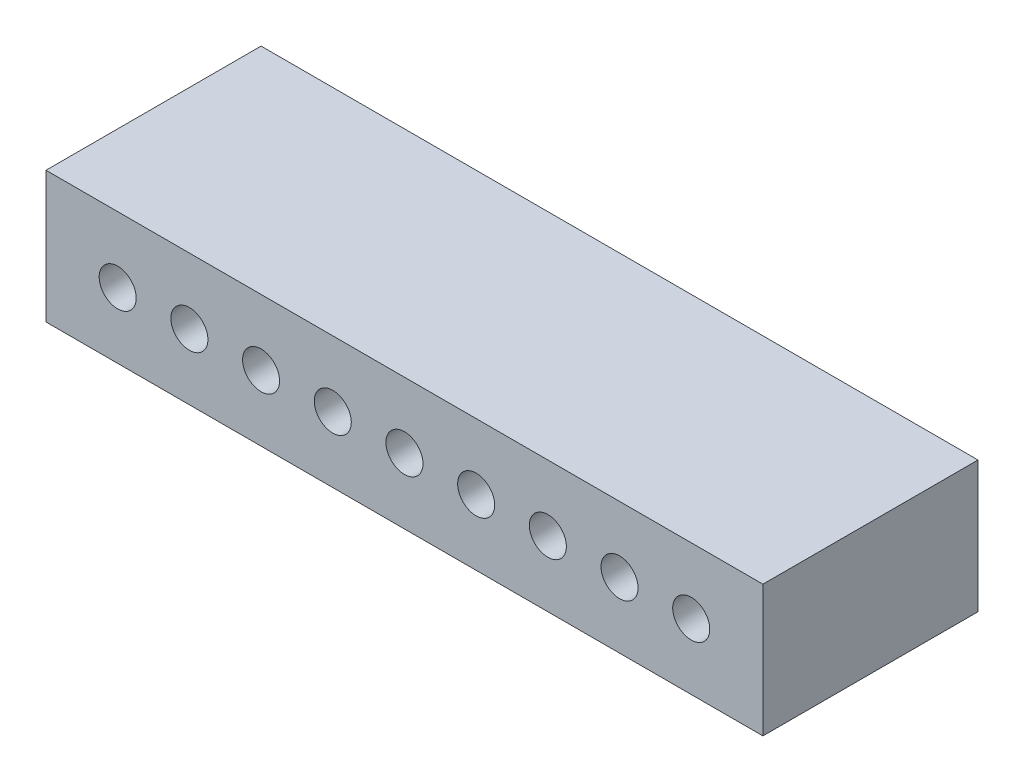
ISO-10303-21;
HEADER;
FILE_DESCRIPTION(('STEP AP214'),'2;1');
FILE_NAME('part.step','',(''),(''),'','','');
FILE_SCHEMA(('AUTOMOTIVE_DESIGN { 1 0 10303 214 1 1 1 1 }'));
ENDSEC;
DATA;
#1=APPLICATION_CONTEXT('core data for automotive mechanical design processes');
#2=APPLICATION_PROTOCOL_DEFINITION('international standard','automotive_design',2000,#1);
#3=PRODUCT_CONTEXT('',#1,'mechanical');
#4=PRODUCT('Part','Part','',(#3));
#5=PRODUCT_RELATED_PRODUCT_CATEGORY('part','',(#4));
#6=PRODUCT_DEFINITION_FORMATION('','',#4);
#7=PRODUCT_DEFINITION_CONTEXT('part definition',#1,'design');
#8=PRODUCT_DEFINITION('design','',#6,#7);
#9=PRODUCT_DEFINITION_SHAPE('','',#8);
#10=(LENGTH_UNIT() NAMED_UNIT(*) SI_UNIT(.MILLI.,.METRE.));
#11=(NAMED_UNIT(*) PLANE_ANGLE_UNIT() SI_UNIT($,.RADIAN.));
#12=(NAMED_UNIT(*) SI_UNIT($,.STERADIAN.) SOLID_ANGLE_UNIT());
#13=UNCERTAINTY_MEASURE_WITH_UNIT(LENGTH_MEASURE(1.E-05),#10,'distance_accuracy_value','');
#14=(GEOMETRIC_REPRESENTATION_CONTEXT(3) GLOBAL_UNCERTAINTY_ASSIGNED_CONTEXT((#13)) GLOBAL_UNIT_ASSIGNED_CONTEXT((#10,
#11,#12)) REPRESENTATION_CONTEXT('',''));
#15=CARTESIAN_POINT('',(0.,0.,0.));
#16=DIRECTION('',(0.,0.,1.));
#17=DIRECTION('',(1.,0.,0.));
#18=AXIS2_PLACEMENT_3D('',#15,#16,#17);
#19=CARTESIAN_POINT('',(30.,11.,-9.));
#20=DIRECTION('',(-1.,0.,0.));
#21=DIRECTION('',(0.,0.,1.));
#22=AXIS2_PLACEMENT_3D('',#19,#20,#21);
#23=PLANE('',#22);
#24=DIRECTION('',(0.,0.,-1.));
#25=VECTOR('',#24,1.);
#26=CARTESIAN_POINT('',(30.,0.,-9.));
#27=LINE('',#26,#25);
#28=CARTESIAN_POINT('',(30.,0.,9.));
#29=VERTEX_POINT('',#28);
#30=CARTESIAN_POINT('',(30.,0.,-9.));
#31=VERTEX_POINT('',#30);
#32=EDGE_CURVE('E107',#29,#31,#27,.T.);
#33=ORIENTED_EDGE('',*,*,#32,.T.);
#34=DIRECTION('',(0.,-1.,0.));
#35=VECTOR('',#34,1.);
#36=CARTESIAN_POINT('',(30.,11.,-9.));
#37=LINE('',#36,#35);
#38=CARTESIAN_POINT('',(30.,11.,-9.));
#39=VERTEX_POINT('',#38);
#40=EDGE_CURVE('E11',#39,#31,#37,.T.);
#41=ORIENTED_EDGE('',*,*,#40,.F.);
#42=DIRECTION('',(0.,0.,-1.));
#43=VECTOR('',#42,1.);
#44=CARTESIAN_POINT('',(30.,11.,-9.));
#45=LINE('',#44,#43);
#46=CARTESIAN_POINT('',(30.,11.,9.));
#47=VERTEX_POINT('',#46);
#48=EDGE_CURVE('E91',#47,#39,#45,.T.);
#49=ORIENTED_EDGE('',*,*,#48,.F.);
#50=DIRECTION('',(0.,-1.,0.));
#51=VECTOR('',#50,1.);
#52=CARTESIAN_POINT('',(30.,11.,9.));
#53=LINE('',#52,#51);
#54=EDGE_CURVE('E103',#47,#29,#53,.T.);
#55=ORIENTED_EDGE('',*,*,#54,.T.);
#56=EDGE_LOOP('',(#33,#41,#49,#55));
#57=FACE_BOUND('',#56,.T.);
#58=ADVANCED_FACE('F39',(#57),#23,.F.);
#59=CARTESIAN_POINT('',(-30.,11.,-9.));
#60=DIRECTION('',(0.,0.,1.));
#61=DIRECTION('',(1.,0.,0.));
#62=AXIS2_PLACEMENT_3D('',#59,#60,#61);
#63=PLANE('',#62);
#64=CARTESIAN_POINT('',(-24.,5.5,-9.));
#65=DIRECTION('',(0.,0.,1.));
#66=DIRECTION('',(1.,0.,0.));
#67=AXIS2_PLACEMENT_3D('',#64,#65,#66);
#68=CIRCLE('',#67,1.54999999999999);
#69=CARTESIAN_POINT('',(-22.45,5.5,-9.));
#70=VERTEX_POINT('',#69);
#71=EDGE_CURVE('E111',#70,#70,#68,.T.);
#72=ORIENTED_EDGE('',*,*,#71,.T.);
#73=EDGE_LOOP('',(#72));
#74=FACE_BOUND('',#73,.T.);
#75=CARTESIAN_POINT('',(-18.,5.5,-9.));
#76=DIRECTION('',(0.,0.,1.));
#77=DIRECTION('',(1.,0.,0.));
#78=AXIS2_PLACEMENT_3D('',#75,#76,#77);
#79=CIRCLE('',#78,1.55);
#80=CARTESIAN_POINT('',(-16.45,5.5,-9.));
#81=VERTEX_POINT('',#80);
#82=EDGE_CURVE('E188',#81,#81,#79,.T.);
#83=ORIENTED_EDGE('',*,*,#82,.T.);
#84=EDGE_LOOP('',(#83));
#85=FACE_BOUND('',#84,.T.);
#86=CARTESIAN_POINT('',(-12.,5.5,-9.));
#87=DIRECTION('',(0.,0.,1.));
#88=DIRECTION('',(1.,0.,0.));
#89=AXIS2_PLACEMENT_3D('',#86,#87,#88);
#90=CIRCLE('',#89,1.55);
#91=CARTESIAN_POINT('',(-10.45,5.5,-9.));
#92=VERTEX_POINT('',#91);
#93=EDGE_CURVE('E180',#92,#92,#90,.T.);
#94=ORIENTED_EDGE('',*,*,#93,.T.);
#95=EDGE_LOOP('',(#94));
#96=FACE_BOUND('',#95,.T.);
#97=CARTESIAN_POINT('',(-6.,5.5,-9.));
#98=DIRECTION('',(0.,0.,1.));
#99=DIRECTION('',(1.,0.,0.));
#100=AXIS2_PLACEMENT_3D('',#97,#98,#99);
#101=CIRCLE('',#100,1.55);
#102=CARTESIAN_POINT('',(-4.45,5.5,-9.));
#103=VERTEX_POINT('',#102);
#104=EDGE_CURVE('E172',#103,#103,#101,.T.);
#105=ORIENTED_EDGE('',*,*,#104,.T.);
#106=EDGE_LOOP('',(#105));
#107=FACE_BOUND('',#106,.T.);
#108=CARTESIAN_POINT('',(0.,5.5,-9.));
#109=DIRECTION('',(0.,0.,1.));
#110=DIRECTION('',(1.,0.,0.));
#111=AXIS2_PLACEMENT_3D('',#108,#109,#110);
#112=CIRCLE('',#111,1.55);
#113=CARTESIAN_POINT('',(1.54999999999999,5.5,-9.));
#114=VERTEX_POINT('',#113);
#115=EDGE_CURVE('E164',#114,#114,#112,.T.);
#116=ORIENTED_EDGE('',*,*,#115,.T.);
#117=EDGE_LOOP('',(#116));
#118=FACE_BOUND('',#117,.T.);
#119=CARTESIAN_POINT('',(6.,5.5,-9.));
#120=DIRECTION('',(0.,0.,1.));
#121=DIRECTION('',(1.,0.,0.));
#122=AXIS2_PLACEMENT_3D('',#119,#120,#121);
#123=CIRCLE('',#122,1.55);
#124=CARTESIAN_POINT('',(7.55,5.5,-9.));
#125=VERTEX_POINT('',#124);
#126=EDGE_CURVE('E156',#125,#125,#123,.T.);
#127=ORIENTED_EDGE('',*,*,#126,.T.);
#128=EDGE_LOOP('',(#127));
#129=FACE_BOUND('',#128,.T.);
#130=CARTESIAN_POINT('',(12.,5.5,-9.));
#131=DIRECTION('',(0.,0.,1.));
#132=DIRECTION('',(1.,0.,0.));
#133=AXIS2_PLACEMENT_3D('',#130,#131,#132);
#134=CIRCLE('',#133,1.55);
#135=CARTESIAN_POINT('',(13.55,5.5,-9.));
#136=VERTEX_POINT('',#135);
#137=EDGE_CURVE('E148',#136,#136,#134,.T.);
#138=ORIENTED_EDGE('',*,*,#137,.T.);
#139=EDGE_LOOP('',(#138));
#140=FACE_BOUND('',#139,.T.);
#141=CARTESIAN_POINT('',(18.,5.5,-9.));
#142=DIRECTION('',(0.,0.,1.));
#143=DIRECTION('',(1.,0.,0.));
#144=AXIS2_PLACEMENT_3D('',#141,#142,#143);
#145=CIRCLE('',#144,1.55);
#146=CARTESIAN_POINT('',(19.55,5.5,-9.));
#147=VERTEX_POINT('',#146);
#148=EDGE_CURVE('E140',#147,#147,#145,.T.);
#149=ORIENTED_EDGE('',*,*,#148,.T.);
#150=EDGE_LOOP('',(#149));
#151=FACE_BOUND('',#150,.T.);
#152=CARTESIAN_POINT('',(24.,5.5,-9.));
#153=DIRECTION('',(0.,0.,1.));
#154=DIRECTION('',(1.,0.,0.));
#155=AXIS2_PLACEMENT_3D('',#152,#153,#154);
#156=CIRCLE('',#155,1.55);
#157=CARTESIAN_POINT('',(25.55,5.5,-9.));
#158=VERTEX_POINT('',#157);
#159=EDGE_CURVE('E132',#158,#158,#156,.T.);
#160=ORIENTED_EDGE('',*,*,#159,.T.);
#161=EDGE_LOOP('',(#160));
#162=FACE_BOUND('',#161,.T.);
#163=DIRECTION('',(-1.,0.,0.));
#164=VECTOR('',#163,1.);
#165=CARTESIAN_POINT('',(-30.,0.,-9.));
#166=LINE('',#165,#164);
#167=CARTESIAN_POINT('',(-30.,0.,-9.));
#168=VERTEX_POINT('',#167);
#169=EDGE_CURVE('E96',#31,#168,#166,.T.);
#170=ORIENTED_EDGE('',*,*,#169,.T.);
#171=DIRECTION('',(0.,-1.,0.));
#172=VECTOR('',#171,1.);
#173=CARTESIAN_POINT('',(-30.,11.,-9.));
#174=LINE('',#173,#172);
#175=CARTESIAN_POINT('',(-30.,11.,-9.));
#176=VERTEX_POINT('',#175);
#177=EDGE_CURVE('E48',#176,#168,#174,.T.);
#178=ORIENTED_EDGE('',*,*,#177,.F.);
#179=DIRECTION('',(-1.,0.,0.));
#180=VECTOR('',#179,1.);
#181=CARTESIAN_POINT('',(-30.,11.,-9.));
#182=LINE('',#181,#180);
#183=EDGE_CURVE('E86',#39,#176,#182,.T.);
#184=ORIENTED_EDGE('',*,*,#183,.F.);
#185=ORIENTED_EDGE('',*,*,#40,.T.);
#186=EDGE_LOOP('',(#170,#178,#184,#185));
#187=FACE_BOUND('',#186,.T.);
#188=ADVANCED_FACE('F95',(#74,#85,#96,#107,#118,#129,#140,#151,#162,#187),#63,.F.);
#189=CARTESIAN_POINT('',(-30.,11.,-9.));
#190=DIRECTION('',(1.,0.,0.));
#191=DIRECTION('',(0.,0.,-1.));
#192=AXIS2_PLACEMENT_3D('',#189,#190,#191);
#193=PLANE('',#192);
#194=DIRECTION('',(0.,0.,1.));
#195=VECTOR('',#194,1.);
#196=CARTESIAN_POINT('',(-30.,0.,-9.));
#197=LINE('',#196,#195);
#198=CARTESIAN_POINT('',(-30.,0.,9.));
#199=VERTEX_POINT('',#198);
#200=EDGE_CURVE('E73',#168,#199,#197,.T.);
#201=ORIENTED_EDGE('',*,*,#200,.T.);
#202=DIRECTION('',(0.,-1.,0.));
#203=VECTOR('',#202,1.);
#204=CARTESIAN_POINT('',(-30.,11.,9.));
#205=LINE('',#204,#203);
#206=CARTESIAN_POINT('',(-30.,11.,9.));
#207=VERTEX_POINT('',#206);
#208=EDGE_CURVE('E98',#207,#199,#205,.T.);
#209=ORIENTED_EDGE('',*,*,#208,.F.);
#210=DIRECTION('',(0.,0.,1.));
#211=VECTOR('',#210,1.);
#212=CARTESIAN_POINT('',(-30.,11.,-9.));
#213=LINE('',#212,#211);
#214=EDGE_CURVE('E89',#176,#207,#213,.T.);
#215=ORIENTED_EDGE('',*,*,#214,.F.);
#216=ORIENTED_EDGE('',*,*,#177,.T.);
#217=EDGE_LOOP('',(#201,#209,#215,#216));
#218=FACE_BOUND('',#217,.T.);
#219=ADVANCED_FACE('F99',(#218),#193,.F.);
#220=CARTESIAN_POINT('',(-30.,11.,9.));
#221=DIRECTION('',(0.,0.,-1.));
#222=DIRECTION('',(-1.,0.,0.));
#223=AXIS2_PLACEMENT_3D('',#220,#221,#222);
#224=PLANE('',#223);
#225=CARTESIAN_POINT('',(-24.,5.5,9.));
#226=DIRECTION('',(0.,0.,1.));
#227=DIRECTION('',(1.,0.,0.));
#228=AXIS2_PLACEMENT_3D('',#225,#226,#227);
#229=CIRCLE('',#228,1.54999999999999);
#230=CARTESIAN_POINT('',(-22.45,5.5,9.));
#231=VERTEX_POINT('',#230);
#232=EDGE_CURVE('E192',#231,#231,#229,.T.);
#233=ORIENTED_EDGE('',*,*,#232,.F.);
#234=EDGE_LOOP('',(#233));
#235=FACE_BOUND('',#234,.T.);
#236=CARTESIAN_POINT('',(-18.,5.5,9.));
#237=DIRECTION('',(0.,0.,1.));
#238=DIRECTION('',(1.,0.,0.));
#239=AXIS2_PLACEMENT_3D('',#236,#237,#238);
#240=CIRCLE('',#239,1.55);
#241=CARTESIAN_POINT('',(-16.45,5.5,9.));
#242=VERTEX_POINT('',#241);
#243=EDGE_CURVE('E184',#242,#242,#240,.T.);
#244=ORIENTED_EDGE('',*,*,#243,.F.);
#245=EDGE_LOOP('',(#244));
#246=FACE_BOUND('',#245,.T.);
#247=CARTESIAN_POINT('',(-12.,5.5,9.));
#248=DIRECTION('',(0.,0.,1.));
#249=DIRECTION('',(1.,0.,0.));
#250=AXIS2_PLACEMENT_3D('',#247,#248,#249);
#251=CIRCLE('',#250,1.55);
#252=CARTESIAN_POINT('',(-10.45,5.5,9.));
#253=VERTEX_POINT('',#252);
#254=EDGE_CURVE('E176',#253,#253,#251,.T.);
#255=ORIENTED_EDGE('',*,*,#254,.F.);
#256=EDGE_LOOP('',(#255));
#257=FACE_BOUND('',#256,.T.);
#258=CARTESIAN_POINT('',(-6.,5.5,9.));
#259=DIRECTION('',(0.,0.,1.));
#260=DIRECTION('',(1.,0.,0.));
#261=AXIS2_PLACEMENT_3D('',#258,#259,#260);
#262=CIRCLE('',#261,1.55);
#263=CARTESIAN_POINT('',(-4.45,5.5,9.));
#264=VERTEX_POINT('',#263);
#265=EDGE_CURVE('E168',#264,#264,#262,.T.);
#266=ORIENTED_EDGE('',*,*,#265,.F.);
#267=EDGE_LOOP('',(#266));
#268=FACE_BOUND('',#267,.T.);
#269=CARTESIAN_POINT('',(0.,5.5,9.));
#270=DIRECTION('',(0.,0.,1.));
#271=DIRECTION('',(1.,0.,0.));
#272=AXIS2_PLACEMENT_3D('',#269,#270,#271);
#273=CIRCLE('',#272,1.55);
#274=CARTESIAN_POINT('',(1.54999999999999,5.5,9.));
#275=VERTEX_POINT('',#274);
#276=EDGE_CURVE('E160',#275,#275,#273,.T.);
#277=ORIENTED_EDGE('',*,*,#276,.F.);
#278=EDGE_LOOP('',(#277));
#279=FACE_BOUND('',#278,.T.);
#280=CARTESIAN_POINT('',(6.,5.5,9.));
#281=DIRECTION('',(0.,0.,1.));
#282=DIRECTION('',(1.,0.,0.));
#283=AXIS2_PLACEMENT_3D('',#280,#281,#282);
#284=CIRCLE('',#283,1.55);
#285=CARTESIAN_POINT('',(7.55,5.5,9.));
#286=VERTEX_POINT('',#285);
#287=EDGE_CURVE('E152',#286,#286,#284,.T.);
#288=ORIENTED_EDGE('',*,*,#287,.F.);
#289=EDGE_LOOP('',(#288));
#290=FACE_BOUND('',#289,.T.);
#291=CARTESIAN_POINT('',(12.,5.5,9.));
#292=DIRECTION('',(0.,0.,1.));
#293=DIRECTION('',(1.,0.,0.));
#294=AXIS2_PLACEMENT_3D('',#291,#292,#293);
#295=CIRCLE('',#294,1.55);
#296=CARTESIAN_POINT('',(13.55,5.5,9.));
#297=VERTEX_POINT('',#296);
#298=EDGE_CURVE('E144',#297,#297,#295,.T.);
#299=ORIENTED_EDGE('',*,*,#298,.F.);
#300=EDGE_LOOP('',(#299));
#301=FACE_BOUND('',#300,.T.);
#302=CARTESIAN_POINT('',(18.,5.5,9.));
#303=DIRECTION('',(0.,0.,1.));
#304=DIRECTION('',(1.,0.,0.));
#305=AXIS2_PLACEMENT_3D('',#302,#303,#304);
#306=CIRCLE('',#305,1.55);
#307=CARTESIAN_POINT('',(19.55,5.5,9.));
#308=VERTEX_POINT('',#307);
#309=EDGE_CURVE('E136',#308,#308,#306,.T.);
#310=ORIENTED_EDGE('',*,*,#309,.F.);
#311=EDGE_LOOP('',(#310));
#312=FACE_BOUND('',#311,.T.);
#313=CARTESIAN_POINT('',(24.,5.5,9.));
#314=DIRECTION('',(0.,0.,1.));
#315=DIRECTION('',(1.,0.,0.));
#316=AXIS2_PLACEMENT_3D('',#313,#314,#315);
#317=CIRCLE('',#316,1.55);
#318=CARTESIAN_POINT('',(25.55,5.5,9.));
#319=VERTEX_POINT('',#318);
#320=EDGE_CURVE('E128',#319,#319,#317,.T.);
#321=ORIENTED_EDGE('',*,*,#320,.F.);
#322=EDGE_LOOP('',(#321));
#323=FACE_BOUND('',#322,.T.);
#324=DIRECTION('',(1.,0.,0.));
#325=VECTOR('',#324,1.);
#326=CARTESIAN_POINT('',(-30.,0.,9.));
#327=LINE('',#326,#325);
#328=EDGE_CURVE('E79',#199,#29,#327,.T.);
#329=ORIENTED_EDGE('',*,*,#328,.T.);
#330=ORIENTED_EDGE('',*,*,#54,.F.);
#331=DIRECTION('',(1.,0.,0.));
#332=VECTOR('',#331,1.);
#333=CARTESIAN_POINT('',(-30.,11.,9.));
#334=LINE('',#333,#332);
#335=EDGE_CURVE('E56',#207,#47,#334,.T.);
#336=ORIENTED_EDGE('',*,*,#335,.F.);
#337=ORIENTED_EDGE('',*,*,#208,.T.);
#338=EDGE_LOOP('',(#329,#330,#336,#337));
#339=FACE_BOUND('',#338,.T.);
#340=ADVANCED_FACE('F121',(#235,#246,#257,#268,#279,#290,#301,#312,#323,#339),#224,.F.);
#341=CARTESIAN_POINT('',(0.,11.,0.));
#342=DIRECTION('',(0.,1.,0.));
#343=DIRECTION('',(0.,0.,1.));
#344=AXIS2_PLACEMENT_3D('',#341,#342,#343);
#345=PLANE('',#344);
#346=ORIENTED_EDGE('',*,*,#48,.T.);
#347=ORIENTED_EDGE('',*,*,#183,.T.);
#348=ORIENTED_EDGE('',*,*,#214,.T.);
#349=ORIENTED_EDGE('',*,*,#335,.T.);
#350=EDGE_LOOP('',(#346,#347,#348,#349));
#351=FACE_BOUND('',#350,.T.);
#352=ADVANCED_FACE('F87',(#351),#345,.T.);
#353=CARTESIAN_POINT('',(0.,0.,0.));
#354=DIRECTION('',(0.,1.,0.));
#355=DIRECTION('',(0.,0.,1.));
#356=AXIS2_PLACEMENT_3D('',#353,#354,#355);
#357=PLANE('',#356);
#358=ORIENTED_EDGE('',*,*,#32,.F.);
#359=ORIENTED_EDGE('',*,*,#328,.F.);
#360=ORIENTED_EDGE('',*,*,#200,.F.);
#361=ORIENTED_EDGE('',*,*,#169,.F.);
#362=EDGE_LOOP('',(#358,#359,#360,#361));
#363=FACE_BOUND('',#362,.T.);
#364=ADVANCED_FACE('F124',(#363),#357,.F.);
#365=CARTESIAN_POINT('',(24.,5.5,-9.));
#366=DIRECTION('',(0.,0.,1.));
#367=DIRECTION('',(1.,0.,0.));
#368=AXIS2_PLACEMENT_3D('',#365,#366,#367);
#369=CYLINDRICAL_SURFACE('',#368,1.55);
#370=ORIENTED_EDGE('',*,*,#159,.F.);
#371=EDGE_LOOP('',(#370));
#372=FACE_BOUND('',#371,.T.);
#373=ORIENTED_EDGE('',*,*,#320,.T.);
#374=EDGE_LOOP('',(#373));
#375=FACE_BOUND('',#374,.T.);
#376=ADVANCED_FACE('F228',(#372,#375),#369,.F.);
#377=CARTESIAN_POINT('',(18.,5.5,-9.));
#378=DIRECTION('',(0.,0.,1.));
#379=DIRECTION('',(1.,0.,0.));
#380=AXIS2_PLACEMENT_3D('',#377,#378,#379);
#381=CYLINDRICAL_SURFACE('',#380,1.55);
#382=ORIENTED_EDGE('',*,*,#148,.F.);
#383=EDGE_LOOP('',(#382));
#384=FACE_BOUND('',#383,.T.);
#385=ORIENTED_EDGE('',*,*,#309,.T.);
#386=EDGE_LOOP('',(#385));
#387=FACE_BOUND('',#386,.T.);
#388=ADVANCED_FACE('F230',(#384,#387),#381,.F.);
#389=CARTESIAN_POINT('',(12.,5.5,-9.));
#390=DIRECTION('',(0.,0.,1.));
#391=DIRECTION('',(1.,0.,0.));
#392=AXIS2_PLACEMENT_3D('',#389,#390,#391);
#393=CYLINDRICAL_SURFACE('',#392,1.55);
#394=ORIENTED_EDGE('',*,*,#137,.F.);
#395=EDGE_LOOP('',(#394));
#396=FACE_BOUND('',#395,.T.);
#397=ORIENTED_EDGE('',*,*,#298,.T.);
#398=EDGE_LOOP('',(#397));
#399=FACE_BOUND('',#398,.T.);
#400=ADVANCED_FACE('F237',(#396,#399),#393,.F.);
#401=CARTESIAN_POINT('',(6.,5.5,-9.));
#402=DIRECTION('',(0.,0.,1.));
#403=DIRECTION('',(1.,0.,0.));
#404=AXIS2_PLACEMENT_3D('',#401,#402,#403);
#405=CYLINDRICAL_SURFACE('',#404,1.55);
#406=ORIENTED_EDGE('',*,*,#126,.F.);
#407=EDGE_LOOP('',(#406));
#408=FACE_BOUND('',#407,.T.);
#409=ORIENTED_EDGE('',*,*,#287,.T.);
#410=EDGE_LOOP('',(#409));
#411=FACE_BOUND('',#410,.T.);
#412=ADVANCED_FACE('F290',(#408,#411),#405,.F.);
#413=CARTESIAN_POINT('',(0.,5.5,-9.));
#414=DIRECTION('',(0.,0.,1.));
#415=DIRECTION('',(1.,0.,0.));
#416=AXIS2_PLACEMENT_3D('',#413,#414,#415);
#417=CYLINDRICAL_SURFACE('',#416,1.55);
#418=ORIENTED_EDGE('',*,*,#115,.F.);
#419=EDGE_LOOP('',(#418));
#420=FACE_BOUND('',#419,.T.);
#421=ORIENTED_EDGE('',*,*,#276,.T.);
#422=EDGE_LOOP('',(#421));
#423=FACE_BOUND('',#422,.T.);
#424=ADVANCED_FACE('F300',(#420,#423),#417,.F.);
#425=CARTESIAN_POINT('',(-6.,5.5,-9.));
#426=DIRECTION('',(0.,0.,1.));
#427=DIRECTION('',(1.,0.,0.));
#428=AXIS2_PLACEMENT_3D('',#425,#426,#427);
#429=CYLINDRICAL_SURFACE('',#428,1.55);
#430=ORIENTED_EDGE('',*,*,#104,.F.);
#431=EDGE_LOOP('',(#430));
#432=FACE_BOUND('',#431,.T.);
#433=ORIENTED_EDGE('',*,*,#265,.T.);
#434=EDGE_LOOP('',(#433));
#435=FACE_BOUND('',#434,.T.);
#436=ADVANCED_FACE('F310',(#432,#435),#429,.F.);
#437=CARTESIAN_POINT('',(-12.,5.5,-9.));
#438=DIRECTION('',(0.,0.,1.));
#439=DIRECTION('',(1.,0.,0.));
#440=AXIS2_PLACEMENT_3D('',#437,#438,#439);
#441=CYLINDRICAL_SURFACE('',#440,1.55);
#442=ORIENTED_EDGE('',*,*,#93,.F.);
#443=EDGE_LOOP('',(#442));
#444=FACE_BOUND('',#443,.T.);
#445=ORIENTED_EDGE('',*,*,#254,.T.);
#446=EDGE_LOOP('',(#445));
#447=FACE_BOUND('',#446,.T.);
#448=ADVANCED_FACE('F320',(#444,#447),#441,.F.);
#449=CARTESIAN_POINT('',(-18.,5.5,-9.));
#450=DIRECTION('',(0.,0.,1.));
#451=DIRECTION('',(1.,0.,0.));
#452=AXIS2_PLACEMENT_3D('',#449,#450,#451);
#453=CYLINDRICAL_SURFACE('',#452,1.55);
#454=ORIENTED_EDGE('',*,*,#82,.F.);
#455=EDGE_LOOP('',(#454));
#456=FACE_BOUND('',#455,.T.);
#457=ORIENTED_EDGE('',*,*,#243,.T.);
#458=EDGE_LOOP('',(#457));
#459=FACE_BOUND('',#458,.T.);
#460=ADVANCED_FACE('F205',(#456,#459),#453,.F.);
#461=CARTESIAN_POINT('',(-24.,5.5,-9.));
#462=DIRECTION('',(0.,0.,1.));
#463=DIRECTION('',(1.,0.,0.));
#464=AXIS2_PLACEMENT_3D('',#461,#462,#463);
#465=CYLINDRICAL_SURFACE('',#464,1.54999999999999);
#466=ORIENTED_EDGE('',*,*,#71,.F.);
#467=EDGE_LOOP('',(#466));
#468=FACE_BOUND('',#467,.T.);
#469=ORIENTED_EDGE('',*,*,#232,.T.);
#470=EDGE_LOOP('',(#469));
#471=FACE_BOUND('',#470,.T.);
#472=ADVANCED_FACE('F202',(#468,#471),#465,.F.);
#473=CLOSED_SHELL('',(#58,#188,#219,#340,#352,#364,#376,#388,#400,#412,#424,#436,#448,#460,#472));
#474=MANIFOLD_SOLID_BREP('B2',#473);
#475=ADVANCED_BREP_SHAPE_REPRESENTATION('',(#18,#474),#14);
#476=SHAPE_DEFINITION_REPRESENTATION(#9,#475);
ENDSEC;
END-ISO-10303-21;
